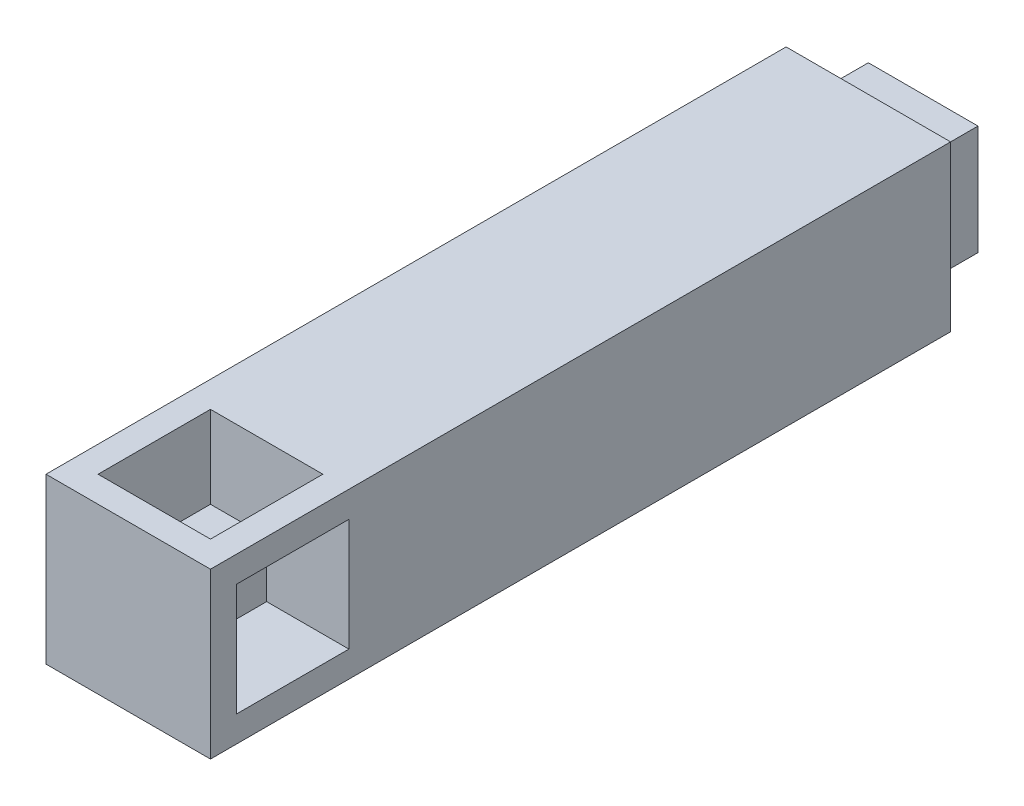
ISO-10303-21;
HEADER;
FILE_DESCRIPTION(('STEP AP214'),'2;1');
FILE_NAME('part.step','',(''),(''),'','','');
FILE_SCHEMA(('AUTOMOTIVE_DESIGN { 1 0 10303 214 1 1 1 1 }'));
ENDSEC;
DATA;
#1=APPLICATION_CONTEXT('core data for automotive mechanical design processes');
#2=APPLICATION_PROTOCOL_DEFINITION('international standard','automotive_design',2000,#1);
#3=PRODUCT_CONTEXT('',#1,'mechanical');
#4=PRODUCT('Part','Part','',(#3));
#5=PRODUCT_RELATED_PRODUCT_CATEGORY('part','',(#4));
#6=PRODUCT_DEFINITION_FORMATION('','',#4);
#7=PRODUCT_DEFINITION_CONTEXT('part definition',#1,'design');
#8=PRODUCT_DEFINITION('design','',#6,#7);
#9=PRODUCT_DEFINITION_SHAPE('','',#8);
#10=(LENGTH_UNIT() NAMED_UNIT(*) SI_UNIT(.MILLI.,.METRE.));
#11=(NAMED_UNIT(*) PLANE_ANGLE_UNIT() SI_UNIT($,.RADIAN.));
#12=(NAMED_UNIT(*) SI_UNIT($,.STERADIAN.) SOLID_ANGLE_UNIT());
#13=UNCERTAINTY_MEASURE_WITH_UNIT(LENGTH_MEASURE(1.E-05),#10,'distance_accuracy_value','');
#14=(GEOMETRIC_REPRESENTATION_CONTEXT(3) GLOBAL_UNCERTAINTY_ASSIGNED_CONTEXT((#13)) GLOBAL_UNIT_ASSIGNED_CONTEXT((#10,
#11,#12)) REPRESENTATION_CONTEXT('',''));
#15=CARTESIAN_POINT('',(0.,0.,0.));
#16=DIRECTION('',(0.,0.,1.));
#17=DIRECTION('',(1.,0.,0.));
#18=AXIS2_PLACEMENT_3D('',#15,#16,#17);
#19=CARTESIAN_POINT('',(0.,0.,0.));
#20=DIRECTION('',(1.,0.,0.));
#21=DIRECTION('',(0.,0.,-1.));
#22=AXIS2_PLACEMENT_3D('',#19,#20,#21);
#23=PLANE('',#22);
#24=DIRECTION('',(0.,1.,0.));
#25=VECTOR('',#24,1.);
#26=CARTESIAN_POINT('',(0.,-10.25,109.75));
#27=LINE('',#26,#25);
#28=CARTESIAN_POINT('',(0.,-10.25,109.75));
#29=VERTEX_POINT('',#28);
#30=CARTESIAN_POINT('',(0.,0.,109.75));
#31=VERTEX_POINT('',#30);
#32=EDGE_CURVE('E191',#29,#31,#27,.T.);
#33=ORIENTED_EDGE('',*,*,#32,.T.);
#34=DIRECTION('',(0.,0.,1.));
#35=VECTOR('',#34,1.);
#36=CARTESIAN_POINT('',(0.,0.,0.));
#37=LINE('',#36,#35);
#38=CARTESIAN_POINT('',(0.,0.,130.25));
#39=VERTEX_POINT('',#38);
#40=EDGE_CURVE('E51',#31,#39,#37,.T.);
#41=ORIENTED_EDGE('',*,*,#40,.T.);
#42=DIRECTION('',(0.,-1.,0.));
#43=VECTOR('',#42,1.);
#44=CARTESIAN_POINT('',(0.,10.25,130.25));
#45=LINE('',#44,#43);
#46=CARTESIAN_POINT('',(0.,-10.25,130.25));
#47=VERTEX_POINT('',#46);
#48=EDGE_CURVE('E170',#39,#47,#45,.T.);
#49=ORIENTED_EDGE('',*,*,#48,.T.);
#50=DIRECTION('',(0.,0.,-1.));
#51=VECTOR('',#50,1.);
#52=CARTESIAN_POINT('',(0.,-10.25,130.25));
#53=LINE('',#52,#51);
#54=EDGE_CURVE('E193',#47,#29,#53,.T.);
#55=ORIENTED_EDGE('',*,*,#54,.T.);
#56=EDGE_LOOP('',(#33,#41,#49,#55));
#57=FACE_BOUND('',#56,.T.);
#58=ADVANCED_FACE('F43',(#57),#23,.T.);
#59=CARTESIAN_POINT('',(0.,0.,0.));
#60=DIRECTION('',(0.,0.,-1.));
#61=DIRECTION('',(-1.,0.,0.));
#62=AXIS2_PLACEMENT_3D('',#59,#60,#61);
#63=PLANE('',#62);
#64=DIRECTION('',(0.,-1.,0.));
#65=VECTOR('',#64,1.);
#66=CARTESIAN_POINT('',(-15.,-15.,0.));
#67=LINE('',#66,#65);
#68=CARTESIAN_POINT('',(-15.,15.,0.));
#69=VERTEX_POINT('',#68);
#70=CARTESIAN_POINT('',(-15.,-15.,0.));
#71=VERTEX_POINT('',#70);
#72=EDGE_CURVE('E241',#69,#71,#67,.T.);
#73=ORIENTED_EDGE('',*,*,#72,.F.);
#74=DIRECTION('',(-1.,0.,0.));
#75=VECTOR('',#74,1.);
#76=CARTESIAN_POINT('',(-15.,15.,0.));
#77=LINE('',#76,#75);
#78=CARTESIAN_POINT('',(15.,15.,0.));
#79=VERTEX_POINT('',#78);
#80=EDGE_CURVE('E255',#79,#69,#77,.T.);
#81=ORIENTED_EDGE('',*,*,#80,.F.);
#82=DIRECTION('',(0.,1.,0.));
#83=VECTOR('',#82,1.);
#84=CARTESIAN_POINT('',(15.,-15.,0.));
#85=LINE('',#84,#83);
#86=CARTESIAN_POINT('',(15.,-15.,0.));
#87=VERTEX_POINT('',#86);
#88=EDGE_CURVE('E264',#87,#79,#85,.T.);
#89=ORIENTED_EDGE('',*,*,#88,.F.);
#90=DIRECTION('',(1.,0.,0.));
#91=VECTOR('',#90,1.);
#92=CARTESIAN_POINT('',(-15.,-15.,0.));
#93=LINE('',#92,#91);
#94=EDGE_CURVE('E263',#71,#87,#93,.T.);
#95=ORIENTED_EDGE('',*,*,#94,.F.);
#96=EDGE_LOOP('',(#73,#81,#89,#95));
#97=FACE_BOUND('',#96,.T.);
#98=DIRECTION('',(-1.,0.,0.));
#99=VECTOR('',#98,1.);
#100=CARTESIAN_POINT('',(-10.,10.,0.));
#101=LINE('',#100,#99);
#102=CARTESIAN_POINT('',(10.,10.,0.));
#103=VERTEX_POINT('',#102);
#104=CARTESIAN_POINT('',(-10.,10.,0.));
#105=VERTEX_POINT('',#104);
#106=EDGE_CURVE('E222',#103,#105,#101,.T.);
#107=ORIENTED_EDGE('',*,*,#106,.T.);
#108=DIRECTION('',(0.,-1.,0.));
#109=VECTOR('',#108,1.);
#110=CARTESIAN_POINT('',(-10.,-10.,0.));
#111=LINE('',#110,#109);
#112=CARTESIAN_POINT('',(-10.,-10.,0.));
#113=VERTEX_POINT('',#112);
#114=EDGE_CURVE('E209',#105,#113,#111,.T.);
#115=ORIENTED_EDGE('',*,*,#114,.T.);
#116=DIRECTION('',(1.,0.,0.));
#117=VECTOR('',#116,1.);
#118=CARTESIAN_POINT('',(-10.,-10.,0.));
#119=LINE('',#118,#117);
#120=CARTESIAN_POINT('',(10.,-10.,0.));
#121=VERTEX_POINT('',#120);
#122=EDGE_CURVE('E232',#113,#121,#119,.T.);
#123=ORIENTED_EDGE('',*,*,#122,.T.);
#124=DIRECTION('',(0.,1.,0.));
#125=VECTOR('',#124,1.);
#126=CARTESIAN_POINT('',(10.,-10.,0.));
#127=LINE('',#126,#125);
#128=EDGE_CURVE('E237',#121,#103,#127,.T.);
#129=ORIENTED_EDGE('',*,*,#128,.T.);
#130=EDGE_LOOP('',(#107,#115,#123,#129));
#131=FACE_BOUND('',#130,.T.);
#132=ADVANCED_FACE('F312',(#97,#131),#63,.T.);
#133=CARTESIAN_POINT('',(-15.,-15.,135.));
#134=DIRECTION('',(1.,0.,0.));
#135=DIRECTION('',(0.,0.,-1.));
#136=AXIS2_PLACEMENT_3D('',#133,#134,#135);
#137=PLANE('',#136);
#138=ORIENTED_EDGE('',*,*,#72,.T.);
#139=DIRECTION('',(0.,0.,-1.));
#140=VECTOR('',#139,1.);
#141=CARTESIAN_POINT('',(-15.,-15.,135.));
#142=LINE('',#141,#140);
#143=CARTESIAN_POINT('',(-15.,-15.,135.));
#144=VERTEX_POINT('',#143);
#145=EDGE_CURVE('E277',#144,#71,#142,.T.);
#146=ORIENTED_EDGE('',*,*,#145,.F.);
#147=DIRECTION('',(0.,-1.,0.));
#148=VECTOR('',#147,1.);
#149=CARTESIAN_POINT('',(-15.,-15.,135.));
#150=LINE('',#149,#148);
#151=CARTESIAN_POINT('',(-15.,15.,135.));
#152=VERTEX_POINT('',#151);
#153=EDGE_CURVE('E246',#152,#144,#150,.T.);
#154=ORIENTED_EDGE('',*,*,#153,.F.);
#155=DIRECTION('',(0.,0.,-1.));
#156=VECTOR('',#155,1.);
#157=CARTESIAN_POINT('',(-15.,15.,135.));
#158=LINE('',#157,#156);
#159=EDGE_CURVE('E257',#152,#69,#158,.T.);
#160=ORIENTED_EDGE('',*,*,#159,.T.);
#161=EDGE_LOOP('',(#138,#146,#154,#160));
#162=FACE_BOUND('',#161,.T.);
#163=ADVANCED_FACE('F44',(#162),#137,.F.);
#164=CARTESIAN_POINT('',(-15.,-15.,135.));
#165=DIRECTION('',(0.,1.,0.));
#166=DIRECTION('',(0.,0.,1.));
#167=AXIS2_PLACEMENT_3D('',#164,#165,#166);
#168=PLANE('',#167);
#169=ORIENTED_EDGE('',*,*,#94,.T.);
#170=DIRECTION('',(0.,0.,-1.));
#171=VECTOR('',#170,1.);
#172=CARTESIAN_POINT('',(15.,-15.,135.));
#173=LINE('',#172,#171);
#174=CARTESIAN_POINT('',(15.,-15.,135.));
#175=VERTEX_POINT('',#174);
#176=EDGE_CURVE('E272',#175,#87,#173,.T.);
#177=ORIENTED_EDGE('',*,*,#176,.F.);
#178=DIRECTION('',(1.,0.,0.));
#179=VECTOR('',#178,1.);
#180=CARTESIAN_POINT('',(-15.,-15.,135.));
#181=LINE('',#180,#179);
#182=EDGE_CURVE('E251',#144,#175,#181,.T.);
#183=ORIENTED_EDGE('',*,*,#182,.F.);
#184=ORIENTED_EDGE('',*,*,#145,.T.);
#185=EDGE_LOOP('',(#169,#177,#183,#184));
#186=FACE_BOUND('',#185,.T.);
#187=ADVANCED_FACE('F359',(#186),#168,.F.);
#188=CARTESIAN_POINT('',(15.,-15.,135.));
#189=DIRECTION('',(-1.,0.,0.));
#190=DIRECTION('',(0.,0.,1.));
#191=AXIS2_PLACEMENT_3D('',#188,#189,#190);
#192=PLANE('',#191);
#193=DIRECTION('',(0.,0.,-1.));
#194=VECTOR('',#193,1.);
#195=CARTESIAN_POINT('',(15.,-10.25,130.25));
#196=LINE('',#195,#194);
#197=CARTESIAN_POINT('',(15.,-10.25,130.25));
#198=VERTEX_POINT('',#197);
#199=CARTESIAN_POINT('',(15.,-10.25,109.75));
#200=VERTEX_POINT('',#199);
#201=EDGE_CURVE('E199',#198,#200,#196,.T.);
#202=ORIENTED_EDGE('',*,*,#201,.F.);
#203=DIRECTION('',(0.,-1.,0.));
#204=VECTOR('',#203,1.);
#205=CARTESIAN_POINT('',(15.,10.25,130.25));
#206=LINE('',#205,#204);
#207=CARTESIAN_POINT('',(15.,10.25,130.25));
#208=VERTEX_POINT('',#207);
#209=EDGE_CURVE('E187',#208,#198,#206,.T.);
#210=ORIENTED_EDGE('',*,*,#209,.F.);
#211=DIRECTION('',(0.,0.,1.));
#212=VECTOR('',#211,1.);
#213=CARTESIAN_POINT('',(15.,10.25,109.75));
#214=LINE('',#213,#212);
#215=CARTESIAN_POINT('',(15.,10.25,109.75));
#216=VERTEX_POINT('',#215);
#217=EDGE_CURVE('E194',#216,#208,#214,.T.);
#218=ORIENTED_EDGE('',*,*,#217,.F.);
#219=DIRECTION('',(0.,1.,0.));
#220=VECTOR('',#219,1.);
#221=CARTESIAN_POINT('',(15.,-10.25,109.75));
#222=LINE('',#221,#220);
#223=EDGE_CURVE('E201',#200,#216,#222,.T.);
#224=ORIENTED_EDGE('',*,*,#223,.F.);
#225=EDGE_LOOP('',(#202,#210,#218,#224));
#226=FACE_BOUND('',#225,.T.);
#227=ORIENTED_EDGE('',*,*,#88,.T.);
#228=DIRECTION('',(0.,0.,-1.));
#229=VECTOR('',#228,1.);
#230=CARTESIAN_POINT('',(15.,15.,135.));
#231=LINE('',#230,#229);
#232=CARTESIAN_POINT('',(15.,15.,135.));
#233=VERTEX_POINT('',#232);
#234=EDGE_CURVE('E269',#233,#79,#231,.T.);
#235=ORIENTED_EDGE('',*,*,#234,.F.);
#236=DIRECTION('',(0.,1.,0.));
#237=VECTOR('',#236,1.);
#238=CARTESIAN_POINT('',(15.,-15.,135.));
#239=LINE('',#238,#237);
#240=EDGE_CURVE('E258',#175,#233,#239,.T.);
#241=ORIENTED_EDGE('',*,*,#240,.F.);
#242=ORIENTED_EDGE('',*,*,#176,.T.);
#243=EDGE_LOOP('',(#227,#235,#241,#242));
#244=FACE_BOUND('',#243,.T.);
#245=ADVANCED_FACE('F299',(#226,#244),#192,.F.);
#246=CARTESIAN_POINT('',(-15.,15.,135.));
#247=DIRECTION('',(0.,-1.,0.));
#248=DIRECTION('',(0.,0.,-1.));
#249=AXIS2_PLACEMENT_3D('',#246,#247,#248);
#250=PLANE('',#249);
#251=DIRECTION('',(1.,0.,0.));
#252=VECTOR('',#251,1.);
#253=CARTESIAN_POINT('',(-10.25,15.,130.25));
#254=LINE('',#253,#252);
#255=CARTESIAN_POINT('',(-10.25,15.,130.25));
#256=VERTEX_POINT('',#255);
#257=CARTESIAN_POINT('',(10.25,15.,130.25));
#258=VERTEX_POINT('',#257);
#259=EDGE_CURVE('E176',#256,#258,#254,.T.);
#260=ORIENTED_EDGE('',*,*,#259,.F.);
#261=DIRECTION('',(0.,0.,1.));
#262=VECTOR('',#261,1.);
#263=CARTESIAN_POINT('',(-10.25,15.,109.75));
#264=LINE('',#263,#262);
#265=CARTESIAN_POINT('',(-10.25,15.,109.75));
#266=VERTEX_POINT('',#265);
#267=EDGE_CURVE('E59',#266,#256,#264,.T.);
#268=ORIENTED_EDGE('',*,*,#267,.F.);
#269=DIRECTION('',(-1.,0.,0.));
#270=VECTOR('',#269,1.);
#271=CARTESIAN_POINT('',(10.25,15.,109.75));
#272=LINE('',#271,#270);
#273=CARTESIAN_POINT('',(10.25,15.,109.75));
#274=VERTEX_POINT('',#273);
#275=EDGE_CURVE('E175',#274,#266,#272,.T.);
#276=ORIENTED_EDGE('',*,*,#275,.F.);
#277=DIRECTION('',(0.,0.,-1.));
#278=VECTOR('',#277,1.);
#279=CARTESIAN_POINT('',(10.25,15.,130.25));
#280=LINE('',#279,#278);
#281=EDGE_CURVE('E173',#258,#274,#280,.T.);
#282=ORIENTED_EDGE('',*,*,#281,.F.);
#283=EDGE_LOOP('',(#260,#268,#276,#282));
#284=FACE_BOUND('',#283,.T.);
#285=ORIENTED_EDGE('',*,*,#80,.T.);
#286=ORIENTED_EDGE('',*,*,#159,.F.);
#287=DIRECTION('',(-1.,0.,0.));
#288=VECTOR('',#287,1.);
#289=CARTESIAN_POINT('',(-15.,15.,135.));
#290=LINE('',#289,#288);
#291=EDGE_CURVE('E256',#233,#152,#290,.T.);
#292=ORIENTED_EDGE('',*,*,#291,.F.);
#293=ORIENTED_EDGE('',*,*,#234,.T.);
#294=EDGE_LOOP('',(#285,#286,#292,#293));
#295=FACE_BOUND('',#294,.T.);
#296=ADVANCED_FACE('F288',(#284,#295),#250,.F.);
#297=CARTESIAN_POINT('',(0.,0.,135.));
#298=DIRECTION('',(0.,0.,-1.));
#299=DIRECTION('',(-1.,0.,0.));
#300=AXIS2_PLACEMENT_3D('',#297,#298,#299);
#301=PLANE('',#300);
#302=ORIENTED_EDGE('',*,*,#153,.T.);
#303=ORIENTED_EDGE('',*,*,#182,.T.);
#304=ORIENTED_EDGE('',*,*,#240,.T.);
#305=ORIENTED_EDGE('',*,*,#291,.T.);
#306=EDGE_LOOP('',(#302,#303,#304,#305));
#307=FACE_BOUND('',#306,.T.);
#308=ADVANCED_FACE('F352',(#307),#301,.F.);
#309=CARTESIAN_POINT('',(-10.,-10.,-10.));
#310=DIRECTION('',(-1.,0.,0.));
#311=DIRECTION('',(0.,0.,1.));
#312=AXIS2_PLACEMENT_3D('',#309,#310,#311);
#313=PLANE('',#312);
#314=ORIENTED_EDGE('',*,*,#114,.F.);
#315=DIRECTION('',(0.,0.,1.));
#316=VECTOR('',#315,1.);
#317=CARTESIAN_POINT('',(-10.,10.,-10.));
#318=LINE('',#317,#316);
#319=CARTESIAN_POINT('',(-10.,10.,-10.));
#320=VERTEX_POINT('',#319);
#321=EDGE_CURVE('E242',#320,#105,#318,.T.);
#322=ORIENTED_EDGE('',*,*,#321,.F.);
#323=DIRECTION('',(0.,-1.,0.));
#324=VECTOR('',#323,1.);
#325=CARTESIAN_POINT('',(-10.,-10.,-10.));
#326=LINE('',#325,#324);
#327=CARTESIAN_POINT('',(-10.,-10.,-10.));
#328=VERTEX_POINT('',#327);
#329=EDGE_CURVE('E220',#320,#328,#326,.T.);
#330=ORIENTED_EDGE('',*,*,#329,.T.);
#331=DIRECTION('',(0.,0.,1.));
#332=VECTOR('',#331,1.);
#333=CARTESIAN_POINT('',(-10.,-10.,-10.));
#334=LINE('',#333,#332);
#335=EDGE_CURVE('E228',#328,#113,#334,.T.);
#336=ORIENTED_EDGE('',*,*,#335,.T.);
#337=EDGE_LOOP('',(#314,#322,#330,#336));
#338=FACE_BOUND('',#337,.T.);
#339=ADVANCED_FACE('F343',(#338),#313,.T.);
#340=CARTESIAN_POINT('',(-10.,10.,-10.));
#341=DIRECTION('',(0.,1.,0.));
#342=DIRECTION('',(0.,0.,1.));
#343=AXIS2_PLACEMENT_3D('',#340,#341,#342);
#344=PLANE('',#343);
#345=ORIENTED_EDGE('',*,*,#106,.F.);
#346=DIRECTION('',(0.,0.,1.));
#347=VECTOR('',#346,1.);
#348=CARTESIAN_POINT('',(10.,10.,-10.));
#349=LINE('',#348,#347);
#350=CARTESIAN_POINT('',(10.,10.,-10.));
#351=VERTEX_POINT('',#350);
#352=EDGE_CURVE('E243',#351,#103,#349,.T.);
#353=ORIENTED_EDGE('',*,*,#352,.F.);
#354=DIRECTION('',(-1.,0.,0.));
#355=VECTOR('',#354,1.);
#356=CARTESIAN_POINT('',(-10.,10.,-10.));
#357=LINE('',#356,#355);
#358=EDGE_CURVE('E230',#351,#320,#357,.T.);
#359=ORIENTED_EDGE('',*,*,#358,.T.);
#360=ORIENTED_EDGE('',*,*,#321,.T.);
#361=EDGE_LOOP('',(#345,#353,#359,#360));
#362=FACE_BOUND('',#361,.T.);
#363=ADVANCED_FACE('F340',(#362),#344,.T.);
#364=CARTESIAN_POINT('',(10.,-10.,-10.));
#365=DIRECTION('',(1.,0.,0.));
#366=DIRECTION('',(0.,0.,-1.));
#367=AXIS2_PLACEMENT_3D('',#364,#365,#366);
#368=PLANE('',#367);
#369=ORIENTED_EDGE('',*,*,#128,.F.);
#370=DIRECTION('',(0.,0.,1.));
#371=VECTOR('',#370,1.);
#372=CARTESIAN_POINT('',(10.,-10.,-10.));
#373=LINE('',#372,#371);
#374=CARTESIAN_POINT('',(10.,-10.,-10.));
#375=VERTEX_POINT('',#374);
#376=EDGE_CURVE('E249',#375,#121,#373,.T.);
#377=ORIENTED_EDGE('',*,*,#376,.F.);
#378=DIRECTION('',(0.,1.,0.));
#379=VECTOR('',#378,1.);
#380=CARTESIAN_POINT('',(10.,-10.,-10.));
#381=LINE('',#380,#379);
#382=EDGE_CURVE('E221',#375,#351,#381,.T.);
#383=ORIENTED_EDGE('',*,*,#382,.T.);
#384=ORIENTED_EDGE('',*,*,#352,.T.);
#385=EDGE_LOOP('',(#369,#377,#383,#384));
#386=FACE_BOUND('',#385,.T.);
#387=ADVANCED_FACE('F338',(#386),#368,.T.);
#388=CARTESIAN_POINT('',(-10.,-10.,-10.));
#389=DIRECTION('',(0.,-1.,0.));
#390=DIRECTION('',(0.,0.,-1.));
#391=AXIS2_PLACEMENT_3D('',#388,#389,#390);
#392=PLANE('',#391);
#393=ORIENTED_EDGE('',*,*,#122,.F.);
#394=ORIENTED_EDGE('',*,*,#335,.F.);
#395=DIRECTION('',(1.,0.,0.));
#396=VECTOR('',#395,1.);
#397=CARTESIAN_POINT('',(-10.,-10.,-10.));
#398=LINE('',#397,#396);
#399=EDGE_CURVE('E219',#328,#375,#398,.T.);
#400=ORIENTED_EDGE('',*,*,#399,.T.);
#401=ORIENTED_EDGE('',*,*,#376,.T.);
#402=EDGE_LOOP('',(#393,#394,#400,#401));
#403=FACE_BOUND('',#402,.T.);
#404=ADVANCED_FACE('F334',(#403),#392,.T.);
#405=CARTESIAN_POINT('',(0.,0.,-10.));
#406=DIRECTION('',(0.,0.,-1.));
#407=DIRECTION('',(-1.,0.,0.));
#408=AXIS2_PLACEMENT_3D('',#405,#406,#407);
#409=PLANE('',#408);
#410=ORIENTED_EDGE('',*,*,#329,.F.);
#411=ORIENTED_EDGE('',*,*,#358,.F.);
#412=ORIENTED_EDGE('',*,*,#382,.F.);
#413=ORIENTED_EDGE('',*,*,#399,.F.);
#414=EDGE_LOOP('',(#410,#411,#412,#413));
#415=FACE_BOUND('',#414,.T.);
#416=ADVANCED_FACE('F328',(#415),#409,.T.);
#417=CARTESIAN_POINT('',(0.,10.25,130.25));
#418=DIRECTION('',(0.,0.,1.));
#419=DIRECTION('',(1.,0.,0.));
#420=AXIS2_PLACEMENT_3D('',#417,#418,#419);
#421=PLANE('',#420);
#422=ORIENTED_EDGE('',*,*,#48,.F.);
#423=DIRECTION('',(1.,0.,0.));
#424=VECTOR('',#423,1.);
#425=CARTESIAN_POINT('',(-10.25,0.,130.25));
#426=LINE('',#425,#424);
#427=CARTESIAN_POINT('',(-10.25,0.,130.25));
#428=VERTEX_POINT('',#427);
#429=EDGE_CURVE('E68',#428,#39,#426,.T.);
#430=ORIENTED_EDGE('',*,*,#429,.F.);
#431=DIRECTION('',(0.,1.,0.));
#432=VECTOR('',#431,1.);
#433=CARTESIAN_POINT('',(-10.25,0.,130.25));
#434=LINE('',#433,#432);
#435=EDGE_CURVE('E154',#428,#256,#434,.T.);
#436=ORIENTED_EDGE('',*,*,#435,.T.);
#437=ORIENTED_EDGE('',*,*,#259,.T.);
#438=DIRECTION('',(0.,1.,0.));
#439=VECTOR('',#438,1.);
#440=CARTESIAN_POINT('',(10.25,0.,130.25));
#441=LINE('',#440,#439);
#442=CARTESIAN_POINT('',(10.25,10.25,130.25));
#443=VERTEX_POINT('',#442);
#444=EDGE_CURVE('E161',#443,#258,#441,.T.);
#445=ORIENTED_EDGE('',*,*,#444,.F.);
#446=DIRECTION('',(1.,0.,0.));
#447=VECTOR('',#446,1.);
#448=CARTESIAN_POINT('',(0.,10.25,130.25));
#449=LINE('',#448,#447);
#450=EDGE_CURVE('E208',#443,#208,#449,.T.);
#451=ORIENTED_EDGE('',*,*,#450,.T.);
#452=ORIENTED_EDGE('',*,*,#209,.T.);
#453=DIRECTION('',(1.,0.,0.));
#454=VECTOR('',#453,1.);
#455=CARTESIAN_POINT('',(0.,-10.25,130.25));
#456=LINE('',#455,#454);
#457=EDGE_CURVE('E196',#47,#198,#456,.T.);
#458=ORIENTED_EDGE('',*,*,#457,.F.);
#459=EDGE_LOOP('',(#422,#430,#436,#437,#445,#451,#452,#458));
#460=FACE_BOUND('',#459,.T.);
#461=ADVANCED_FACE('F164',(#460),#421,.F.);
#462=CARTESIAN_POINT('',(0.,10.25,109.75));
#463=DIRECTION('',(0.,1.,0.));
#464=DIRECTION('',(0.,0.,1.));
#465=AXIS2_PLACEMENT_3D('',#462,#463,#464);
#466=PLANE('',#465);
#467=ORIENTED_EDGE('',*,*,#450,.F.);
#468=DIRECTION('',(0.,0.,-1.));
#469=VECTOR('',#468,1.);
#470=CARTESIAN_POINT('',(10.25,10.25,109.75));
#471=LINE('',#470,#469);
#472=CARTESIAN_POINT('',(10.25,10.25,109.75));
#473=VERTEX_POINT('',#472);
#474=EDGE_CURVE('E11',#443,#473,#471,.T.);
#475=ORIENTED_EDGE('',*,*,#474,.T.);
#476=DIRECTION('',(1.,0.,0.));
#477=VECTOR('',#476,1.);
#478=CARTESIAN_POINT('',(0.,10.25,109.75));
#479=LINE('',#478,#477);
#480=EDGE_CURVE('E211',#473,#216,#479,.T.);
#481=ORIENTED_EDGE('',*,*,#480,.T.);
#482=ORIENTED_EDGE('',*,*,#217,.T.);
#483=EDGE_LOOP('',(#467,#475,#481,#482));
#484=FACE_BOUND('',#483,.T.);
#485=ADVANCED_FACE('F295',(#484),#466,.F.);
#486=CARTESIAN_POINT('',(0.,-10.25,109.75));
#487=DIRECTION('',(0.,0.,-1.));
#488=DIRECTION('',(-1.,0.,0.));
#489=AXIS2_PLACEMENT_3D('',#486,#487,#488);
#490=PLANE('',#489);
#491=ORIENTED_EDGE('',*,*,#480,.F.);
#492=DIRECTION('',(0.,1.,0.));
#493=VECTOR('',#492,1.);
#494=CARTESIAN_POINT('',(10.25,0.,109.75));
#495=LINE('',#494,#493);
#496=EDGE_CURVE('E190',#473,#274,#495,.T.);
#497=ORIENTED_EDGE('',*,*,#496,.T.);
#498=ORIENTED_EDGE('',*,*,#275,.T.);
#499=DIRECTION('',(0.,1.,0.));
#500=VECTOR('',#499,1.);
#501=CARTESIAN_POINT('',(-10.25,0.,109.75));
#502=LINE('',#501,#500);
#503=CARTESIAN_POINT('',(-10.25,0.,109.75));
#504=VERTEX_POINT('',#503);
#505=EDGE_CURVE('E184',#504,#266,#502,.T.);
#506=ORIENTED_EDGE('',*,*,#505,.F.);
#507=DIRECTION('',(-1.,0.,0.));
#508=VECTOR('',#507,1.);
#509=CARTESIAN_POINT('',(10.25,0.,109.75));
#510=LINE('',#509,#508);
#511=EDGE_CURVE('E165',#31,#504,#510,.T.);
#512=ORIENTED_EDGE('',*,*,#511,.F.);
#513=ORIENTED_EDGE('',*,*,#32,.F.);
#514=DIRECTION('',(1.,0.,0.));
#515=VECTOR('',#514,1.);
#516=CARTESIAN_POINT('',(0.,-10.25,109.75));
#517=LINE('',#516,#515);
#518=EDGE_CURVE('E213',#29,#200,#517,.T.);
#519=ORIENTED_EDGE('',*,*,#518,.T.);
#520=ORIENTED_EDGE('',*,*,#223,.T.);
#521=EDGE_LOOP('',(#491,#497,#498,#506,#512,#513,#519,#520));
#522=FACE_BOUND('',#521,.T.);
#523=ADVANCED_FACE('F285',(#522),#490,.F.);
#524=CARTESIAN_POINT('',(0.,-10.25,130.25));
#525=DIRECTION('',(0.,-1.,0.));
#526=DIRECTION('',(0.,0.,-1.));
#527=AXIS2_PLACEMENT_3D('',#524,#525,#526);
#528=PLANE('',#527);
#529=ORIENTED_EDGE('',*,*,#201,.T.);
#530=ORIENTED_EDGE('',*,*,#518,.F.);
#531=ORIENTED_EDGE('',*,*,#54,.F.);
#532=ORIENTED_EDGE('',*,*,#457,.T.);
#533=EDGE_LOOP('',(#529,#530,#531,#532));
#534=FACE_BOUND('',#533,.T.);
#535=ADVANCED_FACE('F304',(#534),#528,.F.);
#536=CARTESIAN_POINT('',(10.25,0.,130.25));
#537=DIRECTION('',(1.,0.,0.));
#538=DIRECTION('',(0.,0.,-1.));
#539=AXIS2_PLACEMENT_3D('',#536,#537,#538);
#540=PLANE('',#539);
#541=ORIENTED_EDGE('',*,*,#444,.T.);
#542=ORIENTED_EDGE('',*,*,#281,.T.);
#543=ORIENTED_EDGE('',*,*,#496,.F.);
#544=ORIENTED_EDGE('',*,*,#474,.F.);
#545=EDGE_LOOP('',(#541,#542,#543,#544));
#546=FACE_BOUND('',#545,.T.);
#547=ADVANCED_FACE('F305',(#546),#540,.F.);
#548=CARTESIAN_POINT('',(-10.25,0.,109.75));
#549=DIRECTION('',(-1.,0.,0.));
#550=DIRECTION('',(0.,0.,1.));
#551=AXIS2_PLACEMENT_3D('',#548,#549,#550);
#552=PLANE('',#551);
#553=ORIENTED_EDGE('',*,*,#267,.T.);
#554=ORIENTED_EDGE('',*,*,#435,.F.);
#555=DIRECTION('',(0.,0.,1.));
#556=VECTOR('',#555,1.);
#557=CARTESIAN_POINT('',(-10.25,0.,109.75));
#558=LINE('',#557,#556);
#559=EDGE_CURVE('E160',#504,#428,#558,.T.);
#560=ORIENTED_EDGE('',*,*,#559,.F.);
#561=ORIENTED_EDGE('',*,*,#505,.T.);
#562=EDGE_LOOP('',(#553,#554,#560,#561));
#563=FACE_BOUND('',#562,.T.);
#564=ADVANCED_FACE('F156',(#563),#552,.F.);
#565=CARTESIAN_POINT('',(0.,0.,0.));
#566=DIRECTION('',(0.,1.,0.));
#567=DIRECTION('',(0.,0.,1.));
#568=AXIS2_PLACEMENT_3D('',#565,#566,#567);
#569=PLANE('',#568);
#570=ORIENTED_EDGE('',*,*,#511,.T.);
#571=ORIENTED_EDGE('',*,*,#559,.T.);
#572=ORIENTED_EDGE('',*,*,#429,.T.);
#573=ORIENTED_EDGE('',*,*,#40,.F.);
#574=EDGE_LOOP('',(#570,#571,#572,#573));
#575=FACE_BOUND('',#574,.T.);
#576=ADVANCED_FACE('F166',(#575),#569,.T.);
#577=CLOSED_SHELL('',(#58,#132,#163,#187,#245,#296,#308,#339,#363,#387,#404,#416,#461,#485,#523,
#535,#547,#564,#576));
#578=MANIFOLD_SOLID_BREP('B2',#577);
#579=ADVANCED_BREP_SHAPE_REPRESENTATION('',(#18,#578),#14);
#580=SHAPE_DEFINITION_REPRESENTATION(#9,#579);
ENDSEC;
END-ISO-10303-21;
